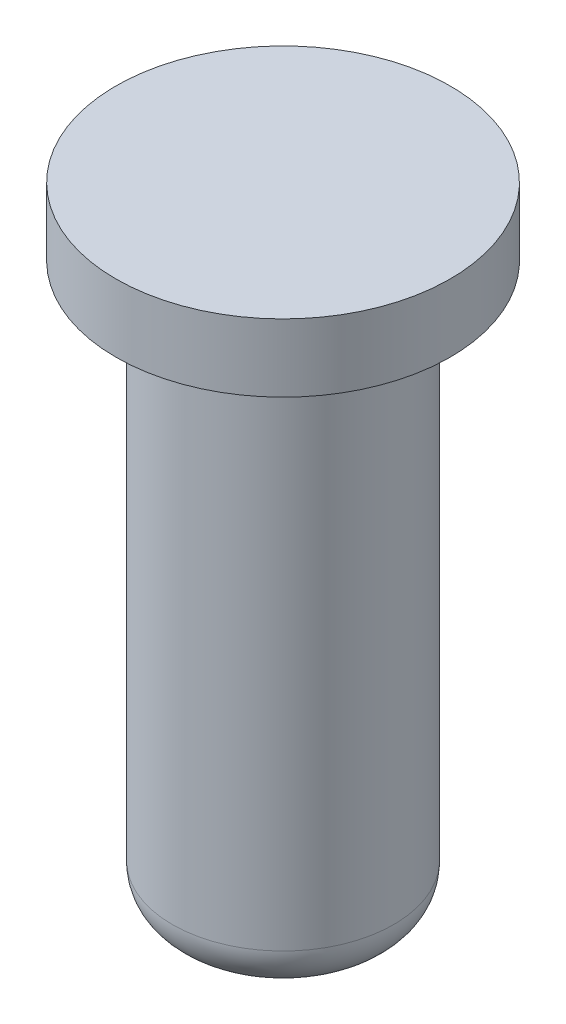
ISO-10303-21;
HEADER;
FILE_DESCRIPTION(('STEP AP214'),'2;1');
FILE_NAME('part.step','',(''),(''),'','','');
FILE_SCHEMA(('AUTOMOTIVE_DESIGN { 1 0 10303 214 1 1 1 1 }'));
ENDSEC;
DATA;
#1=APPLICATION_CONTEXT('core data for automotive mechanical design processes');
#2=APPLICATION_PROTOCOL_DEFINITION('international standard','automotive_design',2000,#1);
#3=PRODUCT_CONTEXT('',#1,'mechanical');
#4=PRODUCT('Part','Part','',(#3));
#5=PRODUCT_RELATED_PRODUCT_CATEGORY('part','',(#4));
#6=PRODUCT_DEFINITION_FORMATION('','',#4);
#7=PRODUCT_DEFINITION_CONTEXT('part definition',#1,'design');
#8=PRODUCT_DEFINITION('design','',#6,#7);
#9=PRODUCT_DEFINITION_SHAPE('','',#8);
#10=(LENGTH_UNIT() NAMED_UNIT(*) SI_UNIT(.MILLI.,.METRE.));
#11=(NAMED_UNIT(*) PLANE_ANGLE_UNIT() SI_UNIT($,.RADIAN.));
#12=(NAMED_UNIT(*) SI_UNIT($,.STERADIAN.) SOLID_ANGLE_UNIT());
#13=UNCERTAINTY_MEASURE_WITH_UNIT(LENGTH_MEASURE(1.E-05),#10,'distance_accuracy_value','');
#14=(GEOMETRIC_REPRESENTATION_CONTEXT(3) GLOBAL_UNCERTAINTY_ASSIGNED_CONTEXT((#13)) GLOBAL_UNIT_ASSIGNED_CONTEXT((#10,
#11,#12)) REPRESENTATION_CONTEXT('',''));
#15=CARTESIAN_POINT('',(0.,0.,0.));
#16=DIRECTION('',(0.,0.,1.));
#17=DIRECTION('',(1.,0.,0.));
#18=AXIS2_PLACEMENT_3D('',#15,#16,#17);
#19=CARTESIAN_POINT('',(0.,25.,0.));
#20=DIRECTION('',(0.,-1.,0.));
#21=DIRECTION('',(0.,0.,-1.));
#22=AXIS2_PLACEMENT_3D('',#19,#20,#21);
#23=CYLINDRICAL_SURFACE('',#22,4.9);
#24=CARTESIAN_POINT('',(0.,2.,0.));
#25=DIRECTION('',(0.,1.,0.));
#26=DIRECTION('',(0.,0.,1.));
#27=AXIS2_PLACEMENT_3D('',#24,#25,#26);
#28=CIRCLE('',#27,4.9);
#29=CARTESIAN_POINT('',(0.,2.,4.9));
#30=VERTEX_POINT('',#29);
#31=EDGE_CURVE('E53',#30,#30,#28,.T.);
#32=ORIENTED_EDGE('',*,*,#31,.T.);
#33=EDGE_LOOP('',(#32));
#34=FACE_BOUND('',#33,.T.);
#35=CARTESIAN_POINT('',(0.,25.,0.));
#36=DIRECTION('',(0.,1.,0.));
#37=DIRECTION('',(0.,0.,1.));
#38=AXIS2_PLACEMENT_3D('',#35,#36,#37);
#39=CIRCLE('',#38,4.9);
#40=CARTESIAN_POINT('',(0.,25.,4.9));
#41=VERTEX_POINT('',#40);
#42=EDGE_CURVE('E58',#41,#41,#39,.T.);
#43=ORIENTED_EDGE('',*,*,#42,.F.);
#44=EDGE_LOOP('',(#43));
#45=FACE_BOUND('',#44,.T.);
#46=ADVANCED_FACE('F45',(#34,#45),#23,.T.);
#47=CARTESIAN_POINT('',(0.,0.,0.));
#48=DIRECTION('',(0.,1.,0.));
#49=DIRECTION('',(0.,0.,1.));
#50=AXIS2_PLACEMENT_3D('',#47,#48,#49);
#51=PLANE('',#50);
#52=CARTESIAN_POINT('',(0.,0.,0.));
#53=DIRECTION('',(0.,1.,0.));
#54=DIRECTION('',(0.,0.,1.));
#55=AXIS2_PLACEMENT_3D('',#52,#53,#54);
#56=CIRCLE('',#55,2.9);
#57=CARTESIAN_POINT('',(0.,0.,2.9));
#58=VERTEX_POINT('',#57);
#59=EDGE_CURVE('E10',#58,#58,#56,.F.);
#60=ORIENTED_EDGE('',*,*,#59,.T.);
#61=EDGE_LOOP('',(#60));
#62=FACE_BOUND('',#61,.T.);
#63=ADVANCED_FACE('F79',(#62),#51,.F.);
#64=CARTESIAN_POINT('',(0.,28.,0.));
#65=DIRECTION('',(0.,-1.,0.));
#66=DIRECTION('',(0.,0.,-1.));
#67=AXIS2_PLACEMENT_3D('',#64,#65,#66);
#68=CYLINDRICAL_SURFACE('',#67,7.4);
#69=CARTESIAN_POINT('',(0.,28.,0.));
#70=DIRECTION('',(0.,1.,0.));
#71=DIRECTION('',(0.,0.,1.));
#72=AXIS2_PLACEMENT_3D('',#69,#70,#71);
#73=CIRCLE('',#72,7.4);
#74=CARTESIAN_POINT('',(0.,28.,7.4));
#75=VERTEX_POINT('',#74);
#76=EDGE_CURVE('E63',#75,#75,#73,.T.);
#77=ORIENTED_EDGE('',*,*,#76,.F.);
#78=EDGE_LOOP('',(#77));
#79=FACE_BOUND('',#78,.T.);
#80=CARTESIAN_POINT('',(0.,25.,0.));
#81=DIRECTION('',(0.,1.,0.));
#82=DIRECTION('',(0.,0.,1.));
#83=AXIS2_PLACEMENT_3D('',#80,#81,#82);
#84=CIRCLE('',#83,7.4);
#85=CARTESIAN_POINT('',(0.,25.,7.4));
#86=VERTEX_POINT('',#85);
#87=EDGE_CURVE('E66',#86,#86,#84,.T.);
#88=ORIENTED_EDGE('',*,*,#87,.T.);
#89=EDGE_LOOP('',(#88));
#90=FACE_BOUND('',#89,.T.);
#91=ADVANCED_FACE('F76',(#79,#90),#68,.T.);
#92=CARTESIAN_POINT('',(0.,28.,0.));
#93=DIRECTION('',(0.,1.,0.));
#94=DIRECTION('',(0.,0.,1.));
#95=AXIS2_PLACEMENT_3D('',#92,#93,#94);
#96=PLANE('',#95);
#97=ORIENTED_EDGE('',*,*,#76,.T.);
#98=EDGE_LOOP('',(#97));
#99=FACE_BOUND('',#98,.T.);
#100=ADVANCED_FACE('F74',(#99),#96,.T.);
#101=CARTESIAN_POINT('',(0.,25.,0.));
#102=DIRECTION('',(0.,1.,0.));
#103=DIRECTION('',(0.,0.,1.));
#104=AXIS2_PLACEMENT_3D('',#101,#102,#103);
#105=PLANE('',#104);
#106=ORIENTED_EDGE('',*,*,#42,.T.);
#107=EDGE_LOOP('',(#106));
#108=FACE_BOUND('',#107,.T.);
#109=ORIENTED_EDGE('',*,*,#87,.F.);
#110=EDGE_LOOP('',(#109));
#111=FACE_BOUND('',#110,.T.);
#112=ADVANCED_FACE('F83',(#108,#111),#105,.F.);
#113=CARTESIAN_POINT('',(0.,2.,0.));
#114=DIRECTION('',(0.,1.,0.));
#115=DIRECTION('',(0.,0.,1.));
#116=AXIS2_PLACEMENT_3D('',#113,#114,#115);
#117=TOROIDAL_SURFACE('',#116,2.9,2.);
#118=ORIENTED_EDGE('',*,*,#59,.F.);
#119=EDGE_LOOP('',(#118));
#120=FACE_BOUND('',#119,.T.);
#121=ORIENTED_EDGE('',*,*,#31,.F.);
#122=EDGE_LOOP('',(#121));
#123=FACE_BOUND('',#122,.T.);
#124=ADVANCED_FACE('F47',(#120,#123),#117,.T.);
#125=CLOSED_SHELL('',(#46,#63,#91,#100,#112,#124));
#126=MANIFOLD_SOLID_BREP('B2',#125);
#127=ADVANCED_BREP_SHAPE_REPRESENTATION('',(#18,#126),#14);
#128=SHAPE_DEFINITION_REPRESENTATION(#9,#127);
ENDSEC;
END-ISO-10303-21;
